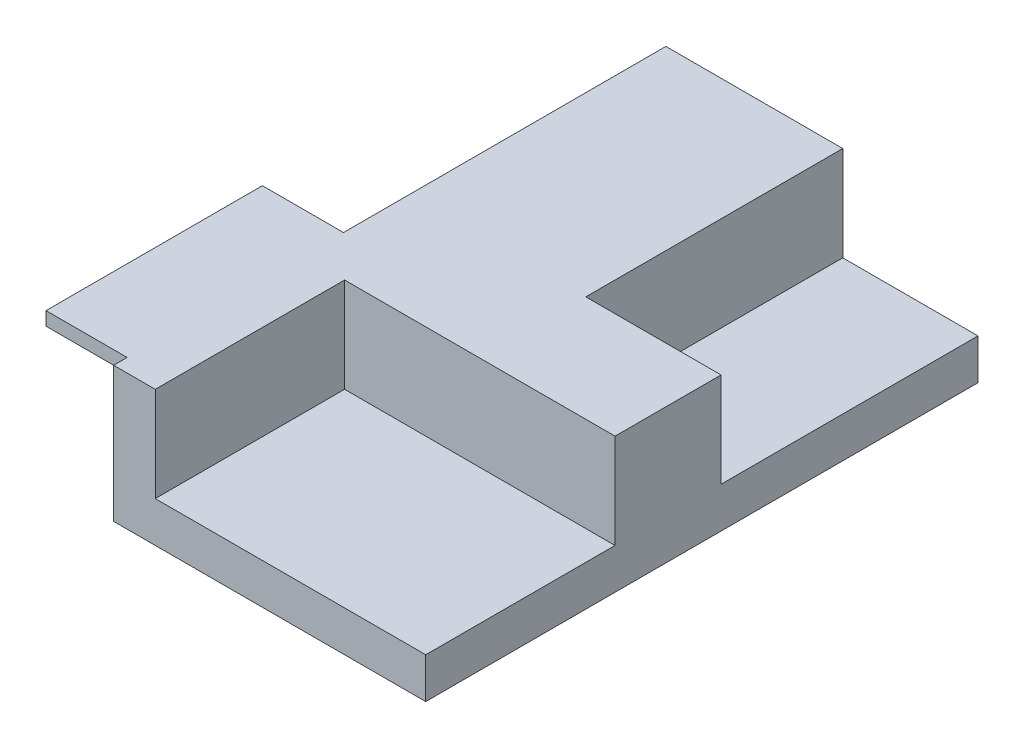
ISO-10303-21;
HEADER;
FILE_DESCRIPTION(('STEP AP214'),'2;1');
FILE_NAME('part.step','',(''),(''),'','','');
FILE_SCHEMA(('AUTOMOTIVE_DESIGN { 1 0 10303 214 1 1 1 1 }'));
ENDSEC;
DATA;
#1=APPLICATION_CONTEXT('core data for automotive mechanical design processes');
#2=APPLICATION_PROTOCOL_DEFINITION('international standard','automotive_design',2000,#1);
#3=PRODUCT_CONTEXT('',#1,'mechanical');
#4=PRODUCT('Part','Part','',(#3));
#5=PRODUCT_RELATED_PRODUCT_CATEGORY('part','',(#4));
#6=PRODUCT_DEFINITION_FORMATION('','',#4);
#7=PRODUCT_DEFINITION_CONTEXT('part definition',#1,'design');
#8=PRODUCT_DEFINITION('design','',#6,#7);
#9=PRODUCT_DEFINITION_SHAPE('','',#8);
#10=(LENGTH_UNIT() NAMED_UNIT(*) SI_UNIT(.MILLI.,.METRE.));
#11=(NAMED_UNIT(*) PLANE_ANGLE_UNIT() SI_UNIT($,.RADIAN.));
#12=(NAMED_UNIT(*) SI_UNIT($,.STERADIAN.) SOLID_ANGLE_UNIT());
#13=UNCERTAINTY_MEASURE_WITH_UNIT(LENGTH_MEASURE(1.E-05),#10,'distance_accuracy_value','');
#14=(GEOMETRIC_REPRESENTATION_CONTEXT(3) GLOBAL_UNCERTAINTY_ASSIGNED_CONTEXT((#13)) GLOBAL_UNIT_ASSIGNED_CONTEXT((#10,
#11,#12)) REPRESENTATION_CONTEXT('',''));
#15=CARTESIAN_POINT('',(0.,0.,0.));
#16=DIRECTION('',(0.,0.,1.));
#17=DIRECTION('',(1.,0.,0.));
#18=AXIS2_PLACEMENT_3D('',#15,#16,#17);
#19=CARTESIAN_POINT('',(-11.54,10.,20.42));
#20=DIRECTION('',(1.,0.,0.));
#21=DIRECTION('',(0.,0.,-1.));
#22=AXIS2_PLACEMENT_3D('',#19,#20,#21);
#23=PLANE('',#22);
#24=DIRECTION('',(0.,-1.,0.));
#25=VECTOR('',#24,1.);
#26=CARTESIAN_POINT('',(-11.54,10.,3.42));
#27=LINE('',#26,#25);
#28=CARTESIAN_POINT('',(-11.54,10.,3.42));
#29=VERTEX_POINT('',#28);
#30=CARTESIAN_POINT('',(-11.54,9.,3.42));
#31=VERTEX_POINT('',#30);
#32=EDGE_CURVE('E253',#29,#31,#27,.T.);
#33=ORIENTED_EDGE('',*,*,#32,.F.);
#34=DIRECTION('',(0.,0.,1.));
#35=VECTOR('',#34,1.);
#36=CARTESIAN_POINT('',(-11.54,10.,20.42));
#37=LINE('',#36,#35);
#38=CARTESIAN_POINT('',(-11.54,10.,-20.42));
#39=VERTEX_POINT('',#38);
#40=EDGE_CURVE('E189',#39,#29,#37,.T.);
#41=ORIENTED_EDGE('',*,*,#40,.F.);
#42=DIRECTION('',(0.,-1.,0.));
#43=VECTOR('',#42,1.);
#44=CARTESIAN_POINT('',(-11.54,10.,-20.42));
#45=LINE('',#44,#43);
#46=CARTESIAN_POINT('',(-11.54,0.,-20.42));
#47=VERTEX_POINT('',#46);
#48=EDGE_CURVE('E41',#39,#47,#45,.T.);
#49=ORIENTED_EDGE('',*,*,#48,.T.);
#50=DIRECTION('',(0.,0.,1.));
#51=VECTOR('',#50,1.);
#52=CARTESIAN_POINT('',(-11.54,0.,20.42));
#53=LINE('',#52,#51);
#54=CARTESIAN_POINT('',(-11.54,0.,20.42));
#55=VERTEX_POINT('',#54);
#56=EDGE_CURVE('E166',#47,#55,#53,.T.);
#57=ORIENTED_EDGE('',*,*,#56,.T.);
#58=DIRECTION('',(0.,-1.,0.));
#59=VECTOR('',#58,1.);
#60=CARTESIAN_POINT('',(-11.54,10.,20.42));
#61=LINE('',#60,#59);
#62=CARTESIAN_POINT('',(-11.54,10.,20.42));
#63=VERTEX_POINT('',#62);
#64=EDGE_CURVE('E180',#63,#55,#61,.T.);
#65=ORIENTED_EDGE('',*,*,#64,.F.);
#66=CARTESIAN_POINT('',(-11.54,10.,19.42));
#67=VERTEX_POINT('',#66);
#68=EDGE_CURVE('E197',#67,#63,#37,.T.);
#69=ORIENTED_EDGE('',*,*,#68,.F.);
#70=DIRECTION('',(0.,1.,0.));
#71=VECTOR('',#70,1.);
#72=CARTESIAN_POINT('',(-11.54,10.,19.42));
#73=LINE('',#72,#71);
#74=CARTESIAN_POINT('',(-11.54,9.,19.42));
#75=VERTEX_POINT('',#74);
#76=EDGE_CURVE('E199',#75,#67,#73,.T.);
#77=ORIENTED_EDGE('',*,*,#76,.F.);
#78=DIRECTION('',(0.,0.,1.));
#79=VECTOR('',#78,1.);
#80=CARTESIAN_POINT('',(-11.54,9.,3.42));
#81=LINE('',#80,#79);
#82=EDGE_CURVE('E213',#31,#75,#81,.T.);
#83=ORIENTED_EDGE('',*,*,#82,.F.);
#84=EDGE_LOOP('',(#33,#41,#49,#57,#65,#69,#77,#83));
#85=FACE_BOUND('',#84,.T.);
#86=ADVANCED_FACE('F33',(#85),#23,.F.);
#87=CARTESIAN_POINT('',(11.54,10.,20.42));
#88=DIRECTION('',(-1.,0.,0.));
#89=DIRECTION('',(0.,0.,1.));
#90=AXIS2_PLACEMENT_3D('',#87,#88,#89);
#91=PLANE('',#90);
#92=DIRECTION('',(0.,0.,-1.));
#93=VECTOR('',#92,1.);
#94=CARTESIAN_POINT('',(11.54,3.,-20.42));
#95=LINE('',#94,#93);
#96=CARTESIAN_POINT('',(11.54,3.,-1.42));
#97=VERTEX_POINT('',#96);
#98=CARTESIAN_POINT('',(11.54,3.,-20.42));
#99=VERTEX_POINT('',#98);
#100=EDGE_CURVE('E136',#97,#99,#95,.T.);
#101=ORIENTED_EDGE('',*,*,#100,.F.);
#102=DIRECTION('',(0.,1.,0.));
#103=VECTOR('',#102,1.);
#104=CARTESIAN_POINT('',(11.54,3.,-1.42));
#105=LINE('',#104,#103);
#106=CARTESIAN_POINT('',(11.54,10.,-1.42));
#107=VERTEX_POINT('',#106);
#108=EDGE_CURVE('E256',#97,#107,#105,.T.);
#109=ORIENTED_EDGE('',*,*,#108,.T.);
#110=DIRECTION('',(0.,0.,-1.));
#111=VECTOR('',#110,1.);
#112=CARTESIAN_POINT('',(11.54,10.,20.42));
#113=LINE('',#112,#111);
#114=CARTESIAN_POINT('',(11.54,10.,6.42));
#115=VERTEX_POINT('',#114);
#116=EDGE_CURVE('E178',#115,#107,#113,.T.);
#117=ORIENTED_EDGE('',*,*,#116,.F.);
#118=DIRECTION('',(0.,1.,0.));
#119=VECTOR('',#118,1.);
#120=CARTESIAN_POINT('',(11.54,3.,6.42));
#121=LINE('',#120,#119);
#122=CARTESIAN_POINT('',(11.54,3.,6.42));
#123=VERTEX_POINT('',#122);
#124=EDGE_CURVE('E56',#123,#115,#121,.T.);
#125=ORIENTED_EDGE('',*,*,#124,.F.);
#126=DIRECTION('',(0.,0.,-1.));
#127=VECTOR('',#126,1.);
#128=CARTESIAN_POINT('',(11.54,3.,20.42));
#129=LINE('',#128,#127);
#130=CARTESIAN_POINT('',(11.54,3.,20.42));
#131=VERTEX_POINT('',#130);
#132=EDGE_CURVE('E231',#131,#123,#129,.T.);
#133=ORIENTED_EDGE('',*,*,#132,.F.);
#134=DIRECTION('',(0.,-1.,0.));
#135=VECTOR('',#134,1.);
#136=CARTESIAN_POINT('',(11.54,10.,20.42));
#137=LINE('',#136,#135);
#138=CARTESIAN_POINT('',(11.54,0.,20.42));
#139=VERTEX_POINT('',#138);
#140=EDGE_CURVE('E159',#131,#139,#137,.T.);
#141=ORIENTED_EDGE('',*,*,#140,.T.);
#142=DIRECTION('',(0.,0.,-1.));
#143=VECTOR('',#142,1.);
#144=CARTESIAN_POINT('',(11.54,0.,20.42));
#145=LINE('',#144,#143);
#146=CARTESIAN_POINT('',(11.54,0.,-20.42));
#147=VERTEX_POINT('',#146);
#148=EDGE_CURVE('E156',#139,#147,#145,.T.);
#149=ORIENTED_EDGE('',*,*,#148,.T.);
#150=DIRECTION('',(0.,-1.,0.));
#151=VECTOR('',#150,1.);
#152=CARTESIAN_POINT('',(11.54,10.,-20.42));
#153=LINE('',#152,#151);
#154=EDGE_CURVE('E11',#99,#147,#153,.T.);
#155=ORIENTED_EDGE('',*,*,#154,.F.);
#156=EDGE_LOOP('',(#101,#109,#117,#125,#133,#141,#149,#155));
#157=FACE_BOUND('',#156,.T.);
#158=ADVANCED_FACE('F35',(#157),#91,.F.);
#159=CARTESIAN_POINT('',(-11.54,10.,-20.42));
#160=DIRECTION('',(0.,0.,1.));
#161=DIRECTION('',(1.,0.,0.));
#162=AXIS2_PLACEMENT_3D('',#159,#160,#161);
#163=PLANE('',#162);
#164=DIRECTION('',(-1.,0.,0.));
#165=VECTOR('',#164,1.);
#166=CARTESIAN_POINT('',(-11.54,10.,-20.42));
#167=LINE('',#166,#165);
#168=CARTESIAN_POINT('',(1.53888227681814,10.,-20.42));
#169=VERTEX_POINT('',#168);
#170=EDGE_CURVE('E203',#169,#39,#167,.T.);
#171=ORIENTED_EDGE('',*,*,#170,.F.);
#172=DIRECTION('',(0.,1.,0.));
#173=VECTOR('',#172,1.);
#174=CARTESIAN_POINT('',(1.53888227681814,3.,-20.42));
#175=LINE('',#174,#173);
#176=CARTESIAN_POINT('',(1.53888227681814,3.,-20.42));
#177=VERTEX_POINT('',#176);
#178=EDGE_CURVE('E48',#177,#169,#175,.T.);
#179=ORIENTED_EDGE('',*,*,#178,.F.);
#180=DIRECTION('',(-1.,0.,0.));
#181=VECTOR('',#180,1.);
#182=CARTESIAN_POINT('',(11.54,3.,-20.42));
#183=LINE('',#182,#181);
#184=EDGE_CURVE('E140',#99,#177,#183,.T.);
#185=ORIENTED_EDGE('',*,*,#184,.F.);
#186=ORIENTED_EDGE('',*,*,#154,.T.);
#187=DIRECTION('',(-1.,0.,0.));
#188=VECTOR('',#187,1.);
#189=CARTESIAN_POINT('',(-11.54,0.,-20.42));
#190=LINE('',#189,#188);
#191=EDGE_CURVE('E163',#147,#47,#190,.T.);
#192=ORIENTED_EDGE('',*,*,#191,.T.);
#193=ORIENTED_EDGE('',*,*,#48,.F.);
#194=EDGE_LOOP('',(#171,#179,#185,#186,#192,#193));
#195=FACE_BOUND('',#194,.T.);
#196=ADVANCED_FACE('F150',(#195),#163,.F.);
#197=CARTESIAN_POINT('',(-11.54,10.,20.42));
#198=DIRECTION('',(0.,0.,-1.));
#199=DIRECTION('',(-1.,0.,0.));
#200=AXIS2_PLACEMENT_3D('',#197,#198,#199);
#201=PLANE('',#200);
#202=DIRECTION('',(1.,0.,0.));
#203=VECTOR('',#202,1.);
#204=CARTESIAN_POINT('',(11.54,3.,20.42));
#205=LINE('',#204,#203);
#206=CARTESIAN_POINT('',(-8.46,3.,20.42));
#207=VERTEX_POINT('',#206);
#208=EDGE_CURVE('E245',#207,#131,#205,.T.);
#209=ORIENTED_EDGE('',*,*,#208,.F.);
#210=DIRECTION('',(0.,1.,0.));
#211=VECTOR('',#210,1.);
#212=CARTESIAN_POINT('',(-8.46,3.,20.42));
#213=LINE('',#212,#211);
#214=CARTESIAN_POINT('',(-8.46,10.,20.42));
#215=VERTEX_POINT('',#214);
#216=EDGE_CURVE('E239',#207,#215,#213,.T.);
#217=ORIENTED_EDGE('',*,*,#216,.T.);
#218=DIRECTION('',(1.,0.,0.));
#219=VECTOR('',#218,1.);
#220=CARTESIAN_POINT('',(-11.54,10.,20.42));
#221=LINE('',#220,#219);
#222=EDGE_CURVE('E172',#63,#215,#221,.T.);
#223=ORIENTED_EDGE('',*,*,#222,.F.);
#224=ORIENTED_EDGE('',*,*,#64,.T.);
#225=DIRECTION('',(1.,0.,0.));
#226=VECTOR('',#225,1.);
#227=CARTESIAN_POINT('',(-11.54,0.,20.42));
#228=LINE('',#227,#226);
#229=EDGE_CURVE('E176',#55,#139,#228,.T.);
#230=ORIENTED_EDGE('',*,*,#229,.T.);
#231=ORIENTED_EDGE('',*,*,#140,.F.);
#232=EDGE_LOOP('',(#209,#217,#223,#224,#230,#231));
#233=FACE_BOUND('',#232,.T.);
#234=ADVANCED_FACE('F193',(#233),#201,.F.);
#235=CARTESIAN_POINT('',(0.,10.,0.));
#236=DIRECTION('',(0.,-1.,0.));
#237=DIRECTION('',(0.,0.,-1.));
#238=AXIS2_PLACEMENT_3D('',#235,#236,#237);
#239=PLANE('',#238);
#240=ORIENTED_EDGE('',*,*,#116,.T.);
#241=DIRECTION('',(1.,0.,0.));
#242=VECTOR('',#241,1.);
#243=CARTESIAN_POINT('',(11.54,10.,-1.42));
#244=LINE('',#243,#242);
#245=CARTESIAN_POINT('',(1.53888227681814,10.,-1.42));
#246=VERTEX_POINT('',#245);
#247=EDGE_CURVE('E146',#246,#107,#244,.T.);
#248=ORIENTED_EDGE('',*,*,#247,.F.);
#249=DIRECTION('',(0.,0.,1.));
#250=VECTOR('',#249,1.);
#251=CARTESIAN_POINT('',(1.53888227681814,10.,-20.42));
#252=LINE('',#251,#250);
#253=EDGE_CURVE('E241',#169,#246,#252,.T.);
#254=ORIENTED_EDGE('',*,*,#253,.F.);
#255=ORIENTED_EDGE('',*,*,#170,.T.);
#256=ORIENTED_EDGE('',*,*,#40,.T.);
#257=DIRECTION('',(1.,0.,0.));
#258=VECTOR('',#257,1.);
#259=CARTESIAN_POINT('',(-17.54,10.,3.42));
#260=LINE('',#259,#258);
#261=CARTESIAN_POINT('',(-17.54,10.,3.42));
#262=VERTEX_POINT('',#261);
#263=EDGE_CURVE('E219',#262,#29,#260,.T.);
#264=ORIENTED_EDGE('',*,*,#263,.F.);
#265=DIRECTION('',(0.,0.,-1.));
#266=VECTOR('',#265,1.);
#267=CARTESIAN_POINT('',(-17.54,10.,3.42));
#268=LINE('',#267,#266);
#269=CARTESIAN_POINT('',(-17.54,10.,19.42));
#270=VERTEX_POINT('',#269);
#271=EDGE_CURVE('E218',#270,#262,#268,.T.);
#272=ORIENTED_EDGE('',*,*,#271,.F.);
#273=DIRECTION('',(1.,0.,0.));
#274=VECTOR('',#273,1.);
#275=CARTESIAN_POINT('',(-17.54,10.,19.42));
#276=LINE('',#275,#274);
#277=EDGE_CURVE('E209',#270,#67,#276,.T.);
#278=ORIENTED_EDGE('',*,*,#277,.T.);
#279=ORIENTED_EDGE('',*,*,#68,.T.);
#280=ORIENTED_EDGE('',*,*,#222,.T.);
#281=DIRECTION('',(0.,0.,1.));
#282=VECTOR('',#281,1.);
#283=CARTESIAN_POINT('',(-8.46,10.,20.42));
#284=LINE('',#283,#282);
#285=CARTESIAN_POINT('',(-8.46,10.,6.42));
#286=VERTEX_POINT('',#285);
#287=EDGE_CURVE('E227',#286,#215,#284,.T.);
#288=ORIENTED_EDGE('',*,*,#287,.F.);
#289=DIRECTION('',(-1.,0.,0.));
#290=VECTOR('',#289,1.);
#291=CARTESIAN_POINT('',(11.54,10.,6.42));
#292=LINE('',#291,#290);
#293=EDGE_CURVE('E228',#115,#286,#292,.T.);
#294=ORIENTED_EDGE('',*,*,#293,.F.);
#295=EDGE_LOOP('',(#240,#248,#254,#255,#256,#264,#272,#278,#279,#280,#288,#294));
#296=FACE_BOUND('',#295,.T.);
#297=ADVANCED_FACE('F216',(#296),#239,.F.);
#298=CARTESIAN_POINT('',(0.,0.,0.));
#299=DIRECTION('',(0.,-1.,0.));
#300=DIRECTION('',(0.,0.,-1.));
#301=AXIS2_PLACEMENT_3D('',#298,#299,#300);
#302=PLANE('',#301);
#303=ORIENTED_EDGE('',*,*,#148,.F.);
#304=ORIENTED_EDGE('',*,*,#229,.F.);
#305=ORIENTED_EDGE('',*,*,#56,.F.);
#306=ORIENTED_EDGE('',*,*,#191,.F.);
#307=EDGE_LOOP('',(#303,#304,#305,#306));
#308=FACE_BOUND('',#307,.T.);
#309=ADVANCED_FACE('F190',(#308),#302,.T.);
#310=CARTESIAN_POINT('',(-17.54,10.,3.42));
#311=DIRECTION('',(0.,0.,1.));
#312=DIRECTION('',(1.,0.,0.));
#313=AXIS2_PLACEMENT_3D('',#310,#311,#312);
#314=PLANE('',#313);
#315=ORIENTED_EDGE('',*,*,#32,.T.);
#316=DIRECTION('',(1.,0.,0.));
#317=VECTOR('',#316,1.);
#318=CARTESIAN_POINT('',(-17.54,9.,3.42));
#319=LINE('',#318,#317);
#320=CARTESIAN_POINT('',(-17.54,9.,3.42));
#321=VERTEX_POINT('',#320);
#322=EDGE_CURVE('E164',#321,#31,#319,.T.);
#323=ORIENTED_EDGE('',*,*,#322,.F.);
#324=DIRECTION('',(0.,-1.,0.));
#325=VECTOR('',#324,1.);
#326=CARTESIAN_POINT('',(-17.54,10.,3.42));
#327=LINE('',#326,#325);
#328=EDGE_CURVE('E212',#262,#321,#327,.T.);
#329=ORIENTED_EDGE('',*,*,#328,.F.);
#330=ORIENTED_EDGE('',*,*,#263,.T.);
#331=EDGE_LOOP('',(#315,#323,#329,#330));
#332=FACE_BOUND('',#331,.T.);
#333=ADVANCED_FACE('F261',(#332),#314,.F.);
#334=CARTESIAN_POINT('',(-17.54,9.,3.42));
#335=DIRECTION('',(0.,1.,0.));
#336=DIRECTION('',(0.,0.,1.));
#337=AXIS2_PLACEMENT_3D('',#334,#335,#336);
#338=PLANE('',#337);
#339=ORIENTED_EDGE('',*,*,#82,.T.);
#340=DIRECTION('',(1.,0.,0.));
#341=VECTOR('',#340,1.);
#342=CARTESIAN_POINT('',(-17.54,9.,19.42));
#343=LINE('',#342,#341);
#344=CARTESIAN_POINT('',(-17.54,9.,19.42));
#345=VERTEX_POINT('',#344);
#346=EDGE_CURVE('E169',#345,#75,#343,.T.);
#347=ORIENTED_EDGE('',*,*,#346,.F.);
#348=DIRECTION('',(0.,0.,1.));
#349=VECTOR('',#348,1.);
#350=CARTESIAN_POINT('',(-17.54,9.,3.42));
#351=LINE('',#350,#349);
#352=EDGE_CURVE('E248',#321,#345,#351,.T.);
#353=ORIENTED_EDGE('',*,*,#352,.F.);
#354=ORIENTED_EDGE('',*,*,#322,.T.);
#355=EDGE_LOOP('',(#339,#347,#353,#354));
#356=FACE_BOUND('',#355,.T.);
#357=ADVANCED_FACE('F258',(#356),#338,.F.);
#358=CARTESIAN_POINT('',(-17.54,10.,19.42));
#359=DIRECTION('',(0.,0.,-1.));
#360=DIRECTION('',(-1.,0.,0.));
#361=AXIS2_PLACEMENT_3D('',#358,#359,#360);
#362=PLANE('',#361);
#363=ORIENTED_EDGE('',*,*,#76,.T.);
#364=ORIENTED_EDGE('',*,*,#277,.F.);
#365=DIRECTION('',(0.,1.,0.));
#366=VECTOR('',#365,1.);
#367=CARTESIAN_POINT('',(-17.54,10.,19.42));
#368=LINE('',#367,#366);
#369=EDGE_CURVE('E250',#345,#270,#368,.T.);
#370=ORIENTED_EDGE('',*,*,#369,.F.);
#371=ORIENTED_EDGE('',*,*,#346,.T.);
#372=EDGE_LOOP('',(#363,#364,#370,#371));
#373=FACE_BOUND('',#372,.T.);
#374=ADVANCED_FACE('F207',(#373),#362,.F.);
#375=CARTESIAN_POINT('',(-17.54,0.,0.));
#376=DIRECTION('',(-1.,0.,0.));
#377=DIRECTION('',(0.,0.,1.));
#378=AXIS2_PLACEMENT_3D('',#375,#376,#377);
#379=PLANE('',#378);
#380=ORIENTED_EDGE('',*,*,#328,.T.);
#381=ORIENTED_EDGE('',*,*,#352,.T.);
#382=ORIENTED_EDGE('',*,*,#369,.T.);
#383=ORIENTED_EDGE('',*,*,#271,.T.);
#384=EDGE_LOOP('',(#380,#381,#382,#383));
#385=FACE_BOUND('',#384,.T.);
#386=ADVANCED_FACE('F264',(#385),#379,.T.);
#387=CARTESIAN_POINT('',(-8.46,3.,20.42));
#388=DIRECTION('',(-1.,0.,0.));
#389=DIRECTION('',(0.,0.,1.));
#390=AXIS2_PLACEMENT_3D('',#387,#388,#389);
#391=PLANE('',#390);
#392=ORIENTED_EDGE('',*,*,#287,.T.);
#393=ORIENTED_EDGE('',*,*,#216,.F.);
#394=DIRECTION('',(0.,0.,1.));
#395=VECTOR('',#394,1.);
#396=CARTESIAN_POINT('',(-8.46,3.,20.42));
#397=LINE('',#396,#395);
#398=CARTESIAN_POINT('',(-8.46,3.,6.42));
#399=VERTEX_POINT('',#398);
#400=EDGE_CURVE('E396',#399,#207,#397,.T.);
#401=ORIENTED_EDGE('',*,*,#400,.F.);
#402=DIRECTION('',(0.,1.,0.));
#403=VECTOR('',#402,1.);
#404=CARTESIAN_POINT('',(-8.46,3.,6.42));
#405=LINE('',#404,#403);
#406=EDGE_CURVE('E242',#399,#286,#405,.T.);
#407=ORIENTED_EDGE('',*,*,#406,.T.);
#408=EDGE_LOOP('',(#392,#393,#401,#407));
#409=FACE_BOUND('',#408,.T.);
#410=ADVANCED_FACE('F266',(#409),#391,.F.);
#411=CARTESIAN_POINT('',(11.54,3.,6.42));
#412=DIRECTION('',(0.,0.,-1.));
#413=DIRECTION('',(-1.,0.,0.));
#414=AXIS2_PLACEMENT_3D('',#411,#412,#413);
#415=PLANE('',#414);
#416=ORIENTED_EDGE('',*,*,#293,.T.);
#417=ORIENTED_EDGE('',*,*,#406,.F.);
#418=DIRECTION('',(-1.,0.,0.));
#419=VECTOR('',#418,1.);
#420=CARTESIAN_POINT('',(11.54,3.,6.42));
#421=LINE('',#420,#419);
#422=EDGE_CURVE('E234',#123,#399,#421,.T.);
#423=ORIENTED_EDGE('',*,*,#422,.F.);
#424=ORIENTED_EDGE('',*,*,#124,.T.);
#425=EDGE_LOOP('',(#416,#417,#423,#424));
#426=FACE_BOUND('',#425,.T.);
#427=ADVANCED_FACE('F272',(#426),#415,.F.);
#428=CARTESIAN_POINT('',(0.,3.,0.));
#429=DIRECTION('',(0.,1.,0.));
#430=DIRECTION('',(0.,0.,1.));
#431=AXIS2_PLACEMENT_3D('',#428,#429,#430);
#432=PLANE('',#431);
#433=ORIENTED_EDGE('',*,*,#132,.T.);
#434=ORIENTED_EDGE('',*,*,#422,.T.);
#435=ORIENTED_EDGE('',*,*,#400,.T.);
#436=ORIENTED_EDGE('',*,*,#208,.T.);
#437=EDGE_LOOP('',(#433,#434,#435,#436));
#438=FACE_BOUND('',#437,.T.);
#439=ADVANCED_FACE('F346',(#438),#432,.T.);
#440=CARTESIAN_POINT('',(11.54,3.,-1.42));
#441=DIRECTION('',(0.,0.,1.));
#442=DIRECTION('',(1.,0.,0.));
#443=AXIS2_PLACEMENT_3D('',#440,#441,#442);
#444=PLANE('',#443);
#445=ORIENTED_EDGE('',*,*,#247,.T.);
#446=ORIENTED_EDGE('',*,*,#108,.F.);
#447=DIRECTION('',(1.,0.,0.));
#448=VECTOR('',#447,1.);
#449=CARTESIAN_POINT('',(11.54,3.,-1.42));
#450=LINE('',#449,#448);
#451=CARTESIAN_POINT('',(1.53888227681814,3.,-1.42));
#452=VERTEX_POINT('',#451);
#453=EDGE_CURVE('E142',#452,#97,#450,.T.);
#454=ORIENTED_EDGE('',*,*,#453,.F.);
#455=DIRECTION('',(0.,1.,0.));
#456=VECTOR('',#455,1.);
#457=CARTESIAN_POINT('',(1.53888227681814,3.,-1.42));
#458=LINE('',#457,#456);
#459=EDGE_CURVE('E386',#452,#246,#458,.T.);
#460=ORIENTED_EDGE('',*,*,#459,.T.);
#461=EDGE_LOOP('',(#445,#446,#454,#460));
#462=FACE_BOUND('',#461,.T.);
#463=ADVANCED_FACE('F354',(#462),#444,.F.);
#464=CARTESIAN_POINT('',(1.53888227681814,3.,-20.42));
#465=DIRECTION('',(-1.,0.,0.));
#466=DIRECTION('',(0.,0.,1.));
#467=AXIS2_PLACEMENT_3D('',#464,#465,#466);
#468=PLANE('',#467);
#469=ORIENTED_EDGE('',*,*,#253,.T.);
#470=ORIENTED_EDGE('',*,*,#459,.F.);
#471=DIRECTION('',(0.,0.,1.));
#472=VECTOR('',#471,1.);
#473=CARTESIAN_POINT('',(1.53888227681814,3.,-20.42));
#474=LINE('',#473,#472);
#475=EDGE_CURVE('E152',#177,#452,#474,.T.);
#476=ORIENTED_EDGE('',*,*,#475,.F.);
#477=ORIENTED_EDGE('',*,*,#178,.T.);
#478=EDGE_LOOP('',(#469,#470,#476,#477));
#479=FACE_BOUND('',#478,.T.);
#480=ADVANCED_FACE('F364',(#479),#468,.F.);
#481=CARTESIAN_POINT('',(0.,3.,0.));
#482=DIRECTION('',(0.,-1.,0.));
#483=DIRECTION('',(0.,0.,-1.));
#484=AXIS2_PLACEMENT_3D('',#481,#482,#483);
#485=PLANE('',#484);
#486=ORIENTED_EDGE('',*,*,#100,.T.);
#487=ORIENTED_EDGE('',*,*,#184,.T.);
#488=ORIENTED_EDGE('',*,*,#475,.T.);
#489=ORIENTED_EDGE('',*,*,#453,.T.);
#490=EDGE_LOOP('',(#486,#487,#488,#489));
#491=FACE_BOUND('',#490,.T.);
#492=ADVANCED_FACE('F138',(#491),#485,.F.);
#493=CLOSED_SHELL('',(#86,#158,#196,#234,#297,#309,#333,#357,#374,#386,#410,#427,#439,#463,#480,#492));
#494=MANIFOLD_SOLID_BREP('B2',#493);
#495=ADVANCED_BREP_SHAPE_REPRESENTATION('',(#18,#494),#14);
#496=SHAPE_DEFINITION_REPRESENTATION(#9,#495);
ENDSEC;
END-ISO-10303-21;
